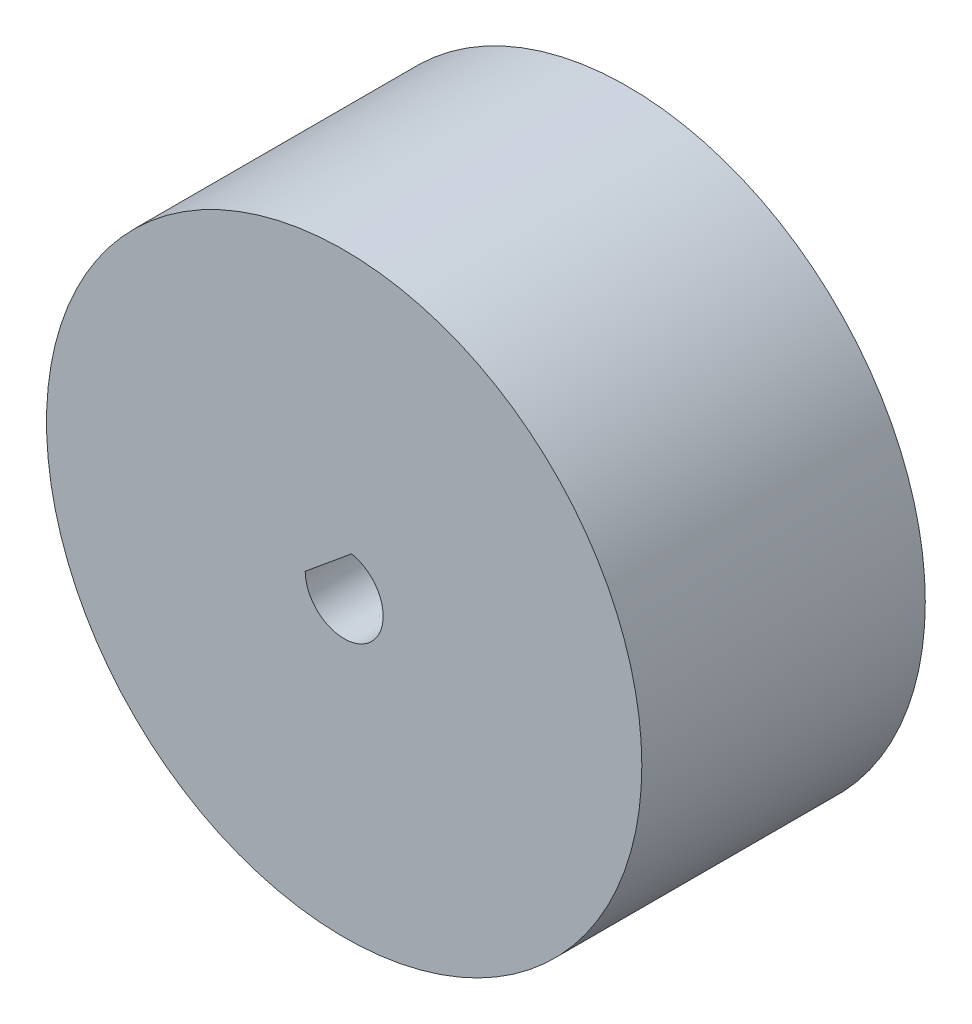
ISO-10303-21;
HEADER;
FILE_DESCRIPTION(('STEP AP214'),'2;1');
FILE_NAME('part.step','',(''),(''),'','','');
FILE_SCHEMA(('AUTOMOTIVE_DESIGN { 1 0 10303 214 1 1 1 1 }'));
ENDSEC;
DATA;
#1=APPLICATION_CONTEXT('core data for automotive mechanical design processes');
#2=APPLICATION_PROTOCOL_DEFINITION('international standard','automotive_design',2000,#1);
#3=PRODUCT_CONTEXT('',#1,'mechanical');
#4=PRODUCT('Part','Part','',(#3));
#5=PRODUCT_RELATED_PRODUCT_CATEGORY('part','',(#4));
#6=PRODUCT_DEFINITION_FORMATION('','',#4);
#7=PRODUCT_DEFINITION_CONTEXT('part definition',#1,'design');
#8=PRODUCT_DEFINITION('design','',#6,#7);
#9=PRODUCT_DEFINITION_SHAPE('','',#8);
#10=(LENGTH_UNIT() NAMED_UNIT(*) SI_UNIT(.MILLI.,.METRE.));
#11=(NAMED_UNIT(*) PLANE_ANGLE_UNIT() SI_UNIT($,.RADIAN.));
#12=(NAMED_UNIT(*) SI_UNIT($,.STERADIAN.) SOLID_ANGLE_UNIT());
#13=UNCERTAINTY_MEASURE_WITH_UNIT(LENGTH_MEASURE(1.E-05),#10,'distance_accuracy_value','');
#14=(GEOMETRIC_REPRESENTATION_CONTEXT(3) GLOBAL_UNCERTAINTY_ASSIGNED_CONTEXT((#13)) GLOBAL_UNIT_ASSIGNED_CONTEXT((#10,
#11,#12)) REPRESENTATION_CONTEXT('',''));
#15=CARTESIAN_POINT('',(0.,0.,0.));
#16=DIRECTION('',(0.,0.,1.));
#17=DIRECTION('',(1.,0.,0.));
#18=AXIS2_PLACEMENT_3D('',#15,#16,#17);
#19=CARTESIAN_POINT('',(0.,0.,20.));
#20=DIRECTION('',(0.,0.,-1.));
#21=DIRECTION('',(-1.,0.,0.));
#22=AXIS2_PLACEMENT_3D('',#19,#20,#21);
#23=CYLINDRICAL_SURFACE('',#22,21.);
#24=CARTESIAN_POINT('',(0.,0.,20.));
#25=DIRECTION('',(0.,0.,1.));
#26=DIRECTION('',(1.,0.,0.));
#27=AXIS2_PLACEMENT_3D('',#24,#25,#26);
#28=CIRCLE('',#27,21.);
#29=CARTESIAN_POINT('',(21.,0.,20.));
#30=VERTEX_POINT('',#29);
#31=EDGE_CURVE('E11',#30,#30,#28,.T.);
#32=ORIENTED_EDGE('',*,*,#31,.F.);
#33=EDGE_LOOP('',(#32));
#34=FACE_BOUND('',#33,.T.);
#35=CARTESIAN_POINT('',(0.,0.,0.));
#36=DIRECTION('',(0.,0.,1.));
#37=DIRECTION('',(1.,0.,0.));
#38=AXIS2_PLACEMENT_3D('',#35,#36,#37);
#39=CIRCLE('',#38,21.);
#40=CARTESIAN_POINT('',(21.,0.,0.));
#41=VERTEX_POINT('',#40);
#42=EDGE_CURVE('E54',#41,#41,#39,.T.);
#43=ORIENTED_EDGE('',*,*,#42,.T.);
#44=EDGE_LOOP('',(#43));
#45=FACE_BOUND('',#44,.T.);
#46=ADVANCED_FACE('F45',(#34,#45),#23,.T.);
#47=CARTESIAN_POINT('',(0.,0.,20.));
#48=DIRECTION('',(0.,0.,1.));
#49=DIRECTION('',(1.,0.,0.));
#50=AXIS2_PLACEMENT_3D('',#47,#48,#49);
#51=PLANE('',#50);
#52=CARTESIAN_POINT('',(0.,0.,20.));
#53=DIRECTION('',(0.,0.,1.));
#54=DIRECTION('',(-1.,0.,0.));
#55=AXIS2_PLACEMENT_3D('',#52,#53,#54);
#56=CIRCLE('',#55,2.75);
#57=CARTESIAN_POINT('',(-2.75,0.,20.));
#58=VERTEX_POINT('',#57);
#59=CARTESIAN_POINT('',(0.522727272727271,2.69986225543954,20.));
#60=VERTEX_POINT('',#59);
#61=EDGE_CURVE('E62',#58,#60,#56,.T.);
#62=ORIENTED_EDGE('',*,*,#61,.F.);
#63=DIRECTION('',(-0.77138921583987,-0.636363636363637,0.));
#64=VECTOR('',#63,1.);
#65=CARTESIAN_POINT('',(-2.75,0.,20.));
#66=LINE('',#65,#64);
#67=EDGE_CURVE('E82',#60,#58,#66,.T.);
#68=ORIENTED_EDGE('',*,*,#67,.F.);
#69=EDGE_LOOP('',(#62,#68));
#70=FACE_BOUND('',#69,.T.);
#71=ORIENTED_EDGE('',*,*,#31,.T.);
#72=EDGE_LOOP('',(#71));
#73=FACE_BOUND('',#72,.T.);
#74=ADVANCED_FACE('F87',(#70,#73),#51,.T.);
#75=CARTESIAN_POINT('',(0.,0.,0.));
#76=DIRECTION('',(0.,0.,1.));
#77=DIRECTION('',(1.,0.,0.));
#78=AXIS2_PLACEMENT_3D('',#75,#76,#77);
#79=PLANE('',#78);
#80=CARTESIAN_POINT('',(0.,11.75,0.));
#81=DIRECTION('',(0.,0.,1.));
#82=DIRECTION('',(1.,0.,0.));
#83=AXIS2_PLACEMENT_3D('',#80,#81,#82);
#84=CIRCLE('',#83,4.25);
#85=CARTESIAN_POINT('',(4.25,11.75,0.));
#86=VERTEX_POINT('',#85);
#87=EDGE_CURVE('E48',#86,#86,#84,.T.);
#88=ORIENTED_EDGE('',*,*,#87,.T.);
#89=EDGE_LOOP('',(#88));
#90=FACE_BOUND('',#89,.T.);
#91=ORIENTED_EDGE('',*,*,#42,.F.);
#92=EDGE_LOOP('',(#91));
#93=FACE_BOUND('',#92,.T.);
#94=ADVANCED_FACE('F104',(#90,#93),#79,.F.);
#95=CARTESIAN_POINT('',(0.,0.,3.));
#96=DIRECTION('',(0.,0.,1.));
#97=DIRECTION('',(1.,0.,0.));
#98=AXIS2_PLACEMENT_3D('',#95,#96,#97);
#99=CYLINDRICAL_SURFACE('',#98,2.75);
#100=ORIENTED_EDGE('',*,*,#61,.T.);
#101=DIRECTION('',(0.,0.,1.));
#102=VECTOR('',#101,1.);
#103=CARTESIAN_POINT('',(0.522727272727271,2.69986225543954,3.));
#104=LINE('',#103,#102);
#105=CARTESIAN_POINT('',(0.522727272727271,2.69986225543954,3.));
#106=VERTEX_POINT('',#105);
#107=EDGE_CURVE('E79',#106,#60,#104,.T.);
#108=ORIENTED_EDGE('',*,*,#107,.F.);
#109=CARTESIAN_POINT('',(0.,0.,3.));
#110=DIRECTION('',(0.,0.,1.));
#111=DIRECTION('',(-1.,0.,0.));
#112=AXIS2_PLACEMENT_3D('',#109,#110,#111);
#113=CIRCLE('',#112,2.75);
#114=CARTESIAN_POINT('',(-2.75,0.,3.));
#115=VERTEX_POINT('',#114);
#116=EDGE_CURVE('E76',#115,#106,#113,.T.);
#117=ORIENTED_EDGE('',*,*,#116,.F.);
#118=DIRECTION('',(0.,0.,1.));
#119=VECTOR('',#118,1.);
#120=CARTESIAN_POINT('',(-2.75,0.,3.));
#121=LINE('',#120,#119);
#122=EDGE_CURVE('E70',#115,#58,#121,.T.);
#123=ORIENTED_EDGE('',*,*,#122,.T.);
#124=EDGE_LOOP('',(#100,#108,#117,#123));
#125=FACE_BOUND('',#124,.T.);
#126=ADVANCED_FACE('F74',(#125),#99,.F.);
#127=CARTESIAN_POINT('',(-2.75,0.,3.));
#128=DIRECTION('',(-0.636363636363637,0.77138921583987,0.));
#129=DIRECTION('',(-0.77138921583987,-0.636363636363637,0.));
#130=AXIS2_PLACEMENT_3D('',#127,#128,#129);
#131=PLANE('',#130);
#132=ORIENTED_EDGE('',*,*,#67,.T.);
#133=ORIENTED_EDGE('',*,*,#122,.F.);
#134=DIRECTION('',(-0.77138921583987,-0.636363636363637,0.));
#135=VECTOR('',#134,1.);
#136=CARTESIAN_POINT('',(-2.75,0.,3.));
#137=LINE('',#136,#135);
#138=EDGE_CURVE('E95',#106,#115,#137,.T.);
#139=ORIENTED_EDGE('',*,*,#138,.F.);
#140=ORIENTED_EDGE('',*,*,#107,.T.);
#141=EDGE_LOOP('',(#132,#133,#139,#140));
#142=FACE_BOUND('',#141,.T.);
#143=ADVANCED_FACE('F83',(#142),#131,.F.);
#144=CARTESIAN_POINT('',(0.,0.,3.));
#145=DIRECTION('',(0.,0.,-1.));
#146=DIRECTION('',(-1.,0.,0.));
#147=AXIS2_PLACEMENT_3D('',#144,#145,#146);
#148=PLANE('',#147);
#149=ORIENTED_EDGE('',*,*,#116,.T.);
#150=ORIENTED_EDGE('',*,*,#138,.T.);
#151=EDGE_LOOP('',(#149,#150));
#152=FACE_BOUND('',#151,.T.);
#153=ADVANCED_FACE('F136',(#152),#148,.F.);
#154=CARTESIAN_POINT('',(0.,11.75,-0.999999999999997));
#155=DIRECTION('',(0.,0.,1.));
#156=DIRECTION('',(1.,0.,0.));
#157=AXIS2_PLACEMENT_3D('',#154,#155,#156);
#158=CYLINDRICAL_SURFACE('',#157,4.25);
#159=CARTESIAN_POINT('',(0.,11.75,17.));
#160=DIRECTION('',(0.,0.,1.));
#161=DIRECTION('',(1.,0.,0.));
#162=AXIS2_PLACEMENT_3D('',#159,#160,#161);
#163=CIRCLE('',#162,4.25);
#164=CARTESIAN_POINT('',(4.25,11.75,17.));
#165=VERTEX_POINT('',#164);
#166=EDGE_CURVE('E93',#165,#165,#163,.T.);
#167=ORIENTED_EDGE('',*,*,#166,.T.);
#168=EDGE_LOOP('',(#167));
#169=FACE_BOUND('',#168,.T.);
#170=ORIENTED_EDGE('',*,*,#87,.F.);
#171=EDGE_LOOP('',(#170));
#172=FACE_BOUND('',#171,.T.);
#173=ADVANCED_FACE('F143',(#169,#172),#158,.F.);
#174=CARTESIAN_POINT('',(0.,11.75,17.));
#175=DIRECTION('',(0.,0.,1.));
#176=DIRECTION('',(1.,0.,0.));
#177=AXIS2_PLACEMENT_3D('',#174,#175,#176);
#178=PLANE('',#177);
#179=ORIENTED_EDGE('',*,*,#166,.F.);
#180=EDGE_LOOP('',(#179));
#181=FACE_BOUND('',#180,.T.);
#182=ADVANCED_FACE('F155',(#181),#178,.F.);
#183=CLOSED_SHELL('',(#46,#74,#94,#126,#143,#153,#173,#182));
#184=MANIFOLD_SOLID_BREP('B2',#183);
#185=ADVANCED_BREP_SHAPE_REPRESENTATION('',(#18,#184),#14);
#186=SHAPE_DEFINITION_REPRESENTATION(#9,#185);
ENDSEC;
END-ISO-10303-21;
